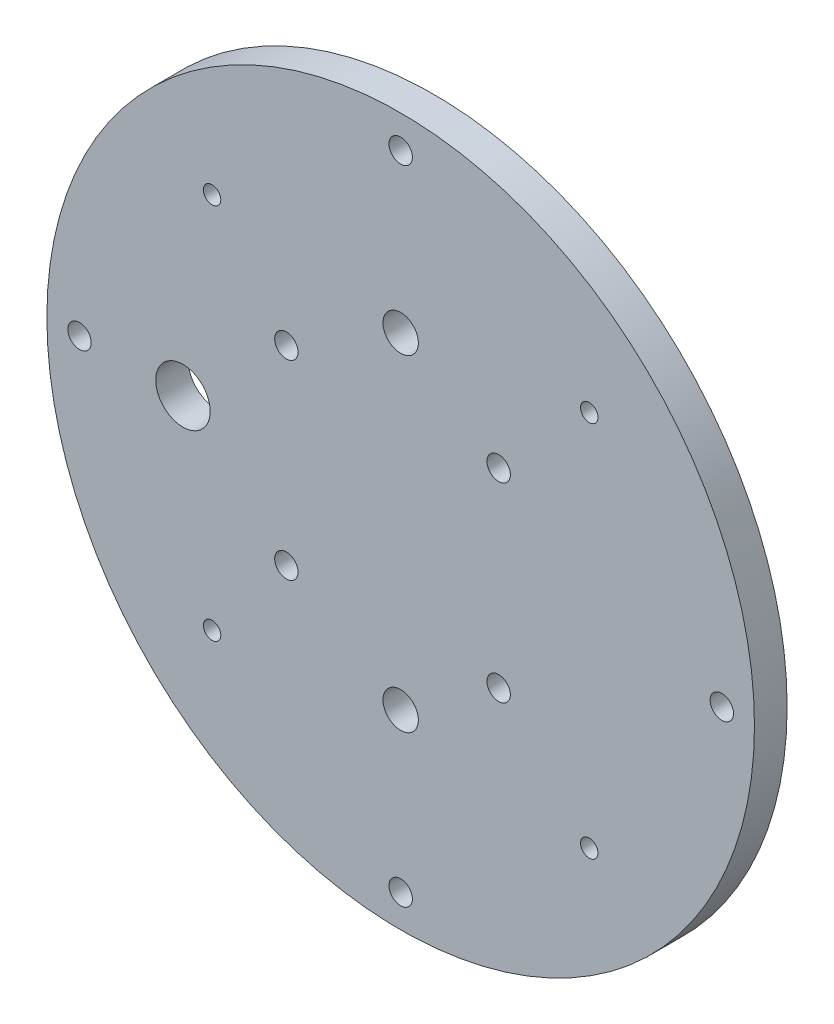
ISO-10303-21;
HEADER;
FILE_DESCRIPTION(('STEP AP214'),'2;1');
FILE_NAME('part.step','',(''),(''),'','','');
FILE_SCHEMA(('AUTOMOTIVE_DESIGN { 1 0 10303 214 1 1 1 1 }'));
ENDSEC;
DATA;
#1=APPLICATION_CONTEXT('core data for automotive mechanical design processes');
#2=APPLICATION_PROTOCOL_DEFINITION('international standard','automotive_design',2000,#1);
#3=PRODUCT_CONTEXT('',#1,'mechanical');
#4=PRODUCT('Part','Part','',(#3));
#5=PRODUCT_RELATED_PRODUCT_CATEGORY('part','',(#4));
#6=PRODUCT_DEFINITION_FORMATION('','',#4);
#7=PRODUCT_DEFINITION_CONTEXT('part definition',#1,'design');
#8=PRODUCT_DEFINITION('design','',#6,#7);
#9=PRODUCT_DEFINITION_SHAPE('','',#8);
#10=(LENGTH_UNIT() NAMED_UNIT(*) SI_UNIT(.MILLI.,.METRE.));
#11=(NAMED_UNIT(*) PLANE_ANGLE_UNIT() SI_UNIT($,.RADIAN.));
#12=(NAMED_UNIT(*) SI_UNIT($,.STERADIAN.) SOLID_ANGLE_UNIT());
#13=UNCERTAINTY_MEASURE_WITH_UNIT(LENGTH_MEASURE(1.E-05),#10,'distance_accuracy_value','');
#14=(GEOMETRIC_REPRESENTATION_CONTEXT(3) GLOBAL_UNCERTAINTY_ASSIGNED_CONTEXT((#13)) GLOBAL_UNIT_ASSIGNED_CONTEXT((#10,
#11,#12)) REPRESENTATION_CONTEXT('',''));
#15=CARTESIAN_POINT('',(0.,0.,0.));
#16=DIRECTION('',(0.,0.,1.));
#17=DIRECTION('',(1.,0.,0.));
#18=AXIS2_PLACEMENT_3D('',#15,#16,#17);
#19=CARTESIAN_POINT('',(0.,0.,6.));
#20=DIRECTION('',(0.,0.,1.));
#21=DIRECTION('',(1.,0.,0.));
#22=AXIS2_PLACEMENT_3D('',#19,#20,#21);
#23=PLANE('',#22);
#24=CARTESIAN_POINT('',(0.,-30.,6.));
#25=DIRECTION('',(0.,0.,1.));
#26=DIRECTION('',(1.,0.,0.));
#27=AXIS2_PLACEMENT_3D('',#24,#25,#26);
#28=CIRCLE('',#27,3.25);
#29=CARTESIAN_POINT('',(3.25,-30.,6.));
#30=VERTEX_POINT('',#29);
#31=EDGE_CURVE('E119',#30,#30,#28,.T.);
#32=ORIENTED_EDGE('',*,*,#31,.F.);
#33=EDGE_LOOP('',(#32));
#34=FACE_BOUND('',#33,.T.);
#35=CARTESIAN_POINT('',(18.,-17.5,6.));
#36=DIRECTION('',(0.,0.,1.));
#37=DIRECTION('',(1.,0.,0.));
#38=AXIS2_PLACEMENT_3D('',#35,#36,#37);
#39=CIRCLE('',#38,2.15);
#40=CARTESIAN_POINT('',(20.15,-17.5,6.));
#41=VERTEX_POINT('',#40);
#42=EDGE_CURVE('E107',#41,#41,#39,.T.);
#43=ORIENTED_EDGE('',*,*,#42,.F.);
#44=EDGE_LOOP('',(#43));
#45=FACE_BOUND('',#44,.T.);
#46=CARTESIAN_POINT('',(-21.,-17.5,6.));
#47=DIRECTION('',(0.,0.,1.));
#48=DIRECTION('',(1.,0.,0.));
#49=AXIS2_PLACEMENT_3D('',#46,#47,#48);
#50=CIRCLE('',#49,2.15);
#51=CARTESIAN_POINT('',(-18.85,-17.5,6.));
#52=VERTEX_POINT('',#51);
#53=EDGE_CURVE('E95',#52,#52,#50,.T.);
#54=ORIENTED_EDGE('',*,*,#53,.F.);
#55=EDGE_LOOP('',(#54));
#56=FACE_BOUND('',#55,.T.);
#57=CARTESIAN_POINT('',(0.,-59.,6.));
#58=DIRECTION('',(0.,0.,1.));
#59=DIRECTION('',(1.,0.,0.));
#60=AXIS2_PLACEMENT_3D('',#57,#58,#59);
#61=CIRCLE('',#60,2.15);
#62=CARTESIAN_POINT('',(2.14999999999999,-59.,6.));
#63=VERTEX_POINT('',#62);
#64=EDGE_CURVE('E83',#63,#63,#61,.T.);
#65=ORIENTED_EDGE('',*,*,#64,.F.);
#66=EDGE_LOOP('',(#65));
#67=FACE_BOUND('',#66,.T.);
#68=CARTESIAN_POINT('',(0.,59.,6.));
#69=DIRECTION('',(0.,0.,1.));
#70=DIRECTION('',(1.,0.,0.));
#71=AXIS2_PLACEMENT_3D('',#68,#69,#70);
#72=CIRCLE('',#71,2.15);
#73=CARTESIAN_POINT('',(2.15,59.,6.));
#74=VERTEX_POINT('',#73);
#75=EDGE_CURVE('E71',#74,#74,#72,.T.);
#76=ORIENTED_EDGE('',*,*,#75,.F.);
#77=EDGE_LOOP('',(#76));
#78=FACE_BOUND('',#77,.T.);
#79=CARTESIAN_POINT('',(34.6482322781408,-34.6482322781408,6.));
#80=DIRECTION('',(0.,0.,1.));
#81=DIRECTION('',(1.,0.,0.));
#82=AXIS2_PLACEMENT_3D('',#79,#80,#81);
#83=CIRCLE('',#82,1.6);
#84=CARTESIAN_POINT('',(36.2482322781408,-34.6482322781408,6.));
#85=VERTEX_POINT('',#84);
#86=EDGE_CURVE('E59',#85,#85,#83,.T.);
#87=ORIENTED_EDGE('',*,*,#86,.F.);
#88=EDGE_LOOP('',(#87));
#89=FACE_BOUND('',#88,.T.);
#90=CARTESIAN_POINT('',(-34.6482322781408,34.6482322781408,6.));
#91=DIRECTION('',(0.,0.,1.));
#92=DIRECTION('',(1.,0.,0.));
#93=AXIS2_PLACEMENT_3D('',#90,#91,#92);
#94=CIRCLE('',#93,1.6);
#95=CARTESIAN_POINT('',(-33.0482322781408,34.6482322781408,6.));
#96=VERTEX_POINT('',#95);
#97=EDGE_CURVE('E47',#96,#96,#94,.T.);
#98=ORIENTED_EDGE('',*,*,#97,.F.);
#99=EDGE_LOOP('',(#98));
#100=FACE_BOUND('',#99,.T.);
#101=CARTESIAN_POINT('',(0.,0.,6.));
#102=DIRECTION('',(0.,0.,1.));
#103=DIRECTION('',(1.,0.,0.));
#104=AXIS2_PLACEMENT_3D('',#101,#102,#103);
#105=CIRCLE('',#104,65.);
#106=CARTESIAN_POINT('',(65.,0.,6.));
#107=VERTEX_POINT('',#106);
#108=EDGE_CURVE('E10',#107,#107,#105,.T.);
#109=ORIENTED_EDGE('',*,*,#108,.T.);
#110=EDGE_LOOP('',(#109));
#111=FACE_BOUND('',#110,.T.);
#112=CARTESIAN_POINT('',(34.6482322781408,34.6482322781408,6.));
#113=DIRECTION('',(0.,0.,1.));
#114=DIRECTION('',(1.,0.,0.));
#115=AXIS2_PLACEMENT_3D('',#112,#113,#114);
#116=CIRCLE('',#115,1.6);
#117=CARTESIAN_POINT('',(36.2482322781408,34.6482322781408,6.));
#118=VERTEX_POINT('',#117);
#119=EDGE_CURVE('E42',#118,#118,#116,.T.);
#120=ORIENTED_EDGE('',*,*,#119,.F.);
#121=EDGE_LOOP('',(#120));
#122=FACE_BOUND('',#121,.T.);
#123=CARTESIAN_POINT('',(-34.6482322781408,-34.6482322781408,6.));
#124=DIRECTION('',(0.,0.,1.));
#125=DIRECTION('',(1.,0.,0.));
#126=AXIS2_PLACEMENT_3D('',#123,#124,#125);
#127=CIRCLE('',#126,1.6);
#128=CARTESIAN_POINT('',(-33.0482322781408,-34.6482322781408,6.));
#129=VERTEX_POINT('',#128);
#130=EDGE_CURVE('E53',#129,#129,#127,.T.);
#131=ORIENTED_EDGE('',*,*,#130,.F.);
#132=EDGE_LOOP('',(#131));
#133=FACE_BOUND('',#132,.T.);
#134=CARTESIAN_POINT('',(59.,0.,6.));
#135=DIRECTION('',(0.,0.,1.));
#136=DIRECTION('',(1.,0.,0.));
#137=AXIS2_PLACEMENT_3D('',#134,#135,#136);
#138=CIRCLE('',#137,2.15);
#139=CARTESIAN_POINT('',(61.15,0.,6.));
#140=VERTEX_POINT('',#139);
#141=EDGE_CURVE('E65',#140,#140,#138,.T.);
#142=ORIENTED_EDGE('',*,*,#141,.F.);
#143=EDGE_LOOP('',(#142));
#144=FACE_BOUND('',#143,.T.);
#145=CARTESIAN_POINT('',(-59.,0.,6.));
#146=DIRECTION('',(0.,0.,1.));
#147=DIRECTION('',(1.,0.,0.));
#148=AXIS2_PLACEMENT_3D('',#145,#146,#147);
#149=CIRCLE('',#148,2.15);
#150=CARTESIAN_POINT('',(-56.85,0.,6.));
#151=VERTEX_POINT('',#150);
#152=EDGE_CURVE('E77',#151,#151,#149,.T.);
#153=ORIENTED_EDGE('',*,*,#152,.F.);
#154=EDGE_LOOP('',(#153));
#155=FACE_BOUND('',#154,.T.);
#156=CARTESIAN_POINT('',(-21.,17.5,6.));
#157=DIRECTION('',(0.,0.,1.));
#158=DIRECTION('',(1.,0.,0.));
#159=AXIS2_PLACEMENT_3D('',#156,#157,#158);
#160=CIRCLE('',#159,2.15);
#161=CARTESIAN_POINT('',(-18.85,17.5,6.));
#162=VERTEX_POINT('',#161);
#163=EDGE_CURVE('E89',#162,#162,#160,.T.);
#164=ORIENTED_EDGE('',*,*,#163,.F.);
#165=EDGE_LOOP('',(#164));
#166=FACE_BOUND('',#165,.T.);
#167=CARTESIAN_POINT('',(18.,17.5,6.));
#168=DIRECTION('',(0.,0.,1.));
#169=DIRECTION('',(1.,0.,0.));
#170=AXIS2_PLACEMENT_3D('',#167,#168,#169);
#171=CIRCLE('',#170,2.15);
#172=CARTESIAN_POINT('',(20.15,17.5,6.));
#173=VERTEX_POINT('',#172);
#174=EDGE_CURVE('E101',#173,#173,#171,.T.);
#175=ORIENTED_EDGE('',*,*,#174,.F.);
#176=EDGE_LOOP('',(#175));
#177=FACE_BOUND('',#176,.T.);
#178=CARTESIAN_POINT('',(0.,30.,6.));
#179=DIRECTION('',(0.,0.,1.));
#180=DIRECTION('',(1.,0.,0.));
#181=AXIS2_PLACEMENT_3D('',#178,#179,#180);
#182=CIRCLE('',#181,3.25);
#183=CARTESIAN_POINT('',(3.25,30.,6.));
#184=VERTEX_POINT('',#183);
#185=EDGE_CURVE('E113',#184,#184,#182,.T.);
#186=ORIENTED_EDGE('',*,*,#185,.F.);
#187=EDGE_LOOP('',(#186));
#188=FACE_BOUND('',#187,.T.);
#189=CARTESIAN_POINT('',(-40.,0.,6.));
#190=DIRECTION('',(0.,0.,1.));
#191=DIRECTION('',(1.,0.,0.));
#192=AXIS2_PLACEMENT_3D('',#189,#190,#191);
#193=CIRCLE('',#192,5.);
#194=CARTESIAN_POINT('',(-35.,0.,6.));
#195=VERTEX_POINT('',#194);
#196=EDGE_CURVE('E125',#195,#195,#193,.T.);
#197=ORIENTED_EDGE('',*,*,#196,.F.);
#198=EDGE_LOOP('',(#197));
#199=FACE_BOUND('',#198,.T.);
#200=ADVANCED_FACE('F31',(#34,#45,#56,#67,#78,#89,#100,#111,#122,#133,#144,#155,#166,#177,#188,
#199),#23,.T.);
#201=CARTESIAN_POINT('',(0.,0.,0.));
#202=DIRECTION('',(0.,0.,1.));
#203=DIRECTION('',(1.,0.,0.));
#204=AXIS2_PLACEMENT_3D('',#201,#202,#203);
#205=PLANE('',#204);
#206=CARTESIAN_POINT('',(0.,0.,0.));
#207=DIRECTION('',(0.,0.,1.));
#208=DIRECTION('',(1.,0.,0.));
#209=AXIS2_PLACEMENT_3D('',#206,#207,#208);
#210=CIRCLE('',#209,65.);
#211=CARTESIAN_POINT('',(65.,0.,0.));
#212=VERTEX_POINT('',#211);
#213=EDGE_CURVE('E35',#212,#212,#210,.T.);
#214=ORIENTED_EDGE('',*,*,#213,.F.);
#215=EDGE_LOOP('',(#214));
#216=FACE_BOUND('',#215,.T.);
#217=CARTESIAN_POINT('',(34.6482322781408,34.6482322781408,0.));
#218=DIRECTION('',(0.,0.,1.));
#219=DIRECTION('',(1.,0.,0.));
#220=AXIS2_PLACEMENT_3D('',#217,#218,#219);
#221=CIRCLE('',#220,1.6);
#222=CARTESIAN_POINT('',(36.2482322781408,34.6482322781408,0.));
#223=VERTEX_POINT('',#222);
#224=EDGE_CURVE('E44',#223,#223,#221,.T.);
#225=ORIENTED_EDGE('',*,*,#224,.T.);
#226=EDGE_LOOP('',(#225));
#227=FACE_BOUND('',#226,.T.);
#228=CARTESIAN_POINT('',(-34.6482322781408,34.6482322781408,0.));
#229=DIRECTION('',(0.,0.,1.));
#230=DIRECTION('',(1.,0.,0.));
#231=AXIS2_PLACEMENT_3D('',#228,#229,#230);
#232=CIRCLE('',#231,1.6);
#233=CARTESIAN_POINT('',(-33.0482322781408,34.6482322781408,0.));
#234=VERTEX_POINT('',#233);
#235=EDGE_CURVE('E50',#234,#234,#232,.T.);
#236=ORIENTED_EDGE('',*,*,#235,.T.);
#237=EDGE_LOOP('',(#236));
#238=FACE_BOUND('',#237,.T.);
#239=CARTESIAN_POINT('',(-34.6482322781408,-34.6482322781408,0.));
#240=DIRECTION('',(0.,0.,1.));
#241=DIRECTION('',(1.,0.,0.));
#242=AXIS2_PLACEMENT_3D('',#239,#240,#241);
#243=CIRCLE('',#242,1.6);
#244=CARTESIAN_POINT('',(-33.0482322781408,-34.6482322781408,0.));
#245=VERTEX_POINT('',#244);
#246=EDGE_CURVE('E56',#245,#245,#243,.T.);
#247=ORIENTED_EDGE('',*,*,#246,.T.);
#248=EDGE_LOOP('',(#247));
#249=FACE_BOUND('',#248,.T.);
#250=CARTESIAN_POINT('',(34.6482322781408,-34.6482322781408,0.));
#251=DIRECTION('',(0.,0.,1.));
#252=DIRECTION('',(1.,0.,0.));
#253=AXIS2_PLACEMENT_3D('',#250,#251,#252);
#254=CIRCLE('',#253,1.6);
#255=CARTESIAN_POINT('',(36.2482322781408,-34.6482322781408,0.));
#256=VERTEX_POINT('',#255);
#257=EDGE_CURVE('E62',#256,#256,#254,.T.);
#258=ORIENTED_EDGE('',*,*,#257,.T.);
#259=EDGE_LOOP('',(#258));
#260=FACE_BOUND('',#259,.T.);
#261=CARTESIAN_POINT('',(59.,0.,0.));
#262=DIRECTION('',(0.,0.,1.));
#263=DIRECTION('',(1.,0.,0.));
#264=AXIS2_PLACEMENT_3D('',#261,#262,#263);
#265=CIRCLE('',#264,2.15);
#266=CARTESIAN_POINT('',(61.15,0.,0.));
#267=VERTEX_POINT('',#266);
#268=EDGE_CURVE('E68',#267,#267,#265,.T.);
#269=ORIENTED_EDGE('',*,*,#268,.T.);
#270=EDGE_LOOP('',(#269));
#271=FACE_BOUND('',#270,.T.);
#272=CARTESIAN_POINT('',(0.,59.,0.));
#273=DIRECTION('',(0.,0.,1.));
#274=DIRECTION('',(1.,0.,0.));
#275=AXIS2_PLACEMENT_3D('',#272,#273,#274);
#276=CIRCLE('',#275,2.15);
#277=CARTESIAN_POINT('',(2.15,59.,0.));
#278=VERTEX_POINT('',#277);
#279=EDGE_CURVE('E74',#278,#278,#276,.T.);
#280=ORIENTED_EDGE('',*,*,#279,.T.);
#281=EDGE_LOOP('',(#280));
#282=FACE_BOUND('',#281,.T.);
#283=CARTESIAN_POINT('',(-59.,0.,0.));
#284=DIRECTION('',(0.,0.,1.));
#285=DIRECTION('',(1.,0.,0.));
#286=AXIS2_PLACEMENT_3D('',#283,#284,#285);
#287=CIRCLE('',#286,2.15);
#288=CARTESIAN_POINT('',(-56.85,0.,0.));
#289=VERTEX_POINT('',#288);
#290=EDGE_CURVE('E80',#289,#289,#287,.T.);
#291=ORIENTED_EDGE('',*,*,#290,.T.);
#292=EDGE_LOOP('',(#291));
#293=FACE_BOUND('',#292,.T.);
#294=CARTESIAN_POINT('',(0.,-59.,0.));
#295=DIRECTION('',(0.,0.,1.));
#296=DIRECTION('',(1.,0.,0.));
#297=AXIS2_PLACEMENT_3D('',#294,#295,#296);
#298=CIRCLE('',#297,2.15);
#299=CARTESIAN_POINT('',(2.14999999999999,-59.,0.));
#300=VERTEX_POINT('',#299);
#301=EDGE_CURVE('E86',#300,#300,#298,.T.);
#302=ORIENTED_EDGE('',*,*,#301,.T.);
#303=EDGE_LOOP('',(#302));
#304=FACE_BOUND('',#303,.T.);
#305=CARTESIAN_POINT('',(-21.,17.5,0.));
#306=DIRECTION('',(0.,0.,1.));
#307=DIRECTION('',(1.,0.,0.));
#308=AXIS2_PLACEMENT_3D('',#305,#306,#307);
#309=CIRCLE('',#308,2.15);
#310=CARTESIAN_POINT('',(-18.85,17.5,0.));
#311=VERTEX_POINT('',#310);
#312=EDGE_CURVE('E92',#311,#311,#309,.T.);
#313=ORIENTED_EDGE('',*,*,#312,.T.);
#314=EDGE_LOOP('',(#313));
#315=FACE_BOUND('',#314,.T.);
#316=CARTESIAN_POINT('',(-21.,-17.5,0.));
#317=DIRECTION('',(0.,0.,1.));
#318=DIRECTION('',(1.,0.,0.));
#319=AXIS2_PLACEMENT_3D('',#316,#317,#318);
#320=CIRCLE('',#319,2.15);
#321=CARTESIAN_POINT('',(-18.85,-17.5,0.));
#322=VERTEX_POINT('',#321);
#323=EDGE_CURVE('E98',#322,#322,#320,.T.);
#324=ORIENTED_EDGE('',*,*,#323,.T.);
#325=EDGE_LOOP('',(#324));
#326=FACE_BOUND('',#325,.T.);
#327=CARTESIAN_POINT('',(18.,17.5,0.));
#328=DIRECTION('',(0.,0.,1.));
#329=DIRECTION('',(1.,0.,0.));
#330=AXIS2_PLACEMENT_3D('',#327,#328,#329);
#331=CIRCLE('',#330,2.15);
#332=CARTESIAN_POINT('',(20.15,17.5,0.));
#333=VERTEX_POINT('',#332);
#334=EDGE_CURVE('E104',#333,#333,#331,.T.);
#335=ORIENTED_EDGE('',*,*,#334,.T.);
#336=EDGE_LOOP('',(#335));
#337=FACE_BOUND('',#336,.T.);
#338=CARTESIAN_POINT('',(18.,-17.5,0.));
#339=DIRECTION('',(0.,0.,1.));
#340=DIRECTION('',(1.,0.,0.));
#341=AXIS2_PLACEMENT_3D('',#338,#339,#340);
#342=CIRCLE('',#341,2.15);
#343=CARTESIAN_POINT('',(20.15,-17.5,0.));
#344=VERTEX_POINT('',#343);
#345=EDGE_CURVE('E110',#344,#344,#342,.T.);
#346=ORIENTED_EDGE('',*,*,#345,.T.);
#347=EDGE_LOOP('',(#346));
#348=FACE_BOUND('',#347,.T.);
#349=CARTESIAN_POINT('',(0.,30.,0.));
#350=DIRECTION('',(0.,0.,1.));
#351=DIRECTION('',(1.,0.,0.));
#352=AXIS2_PLACEMENT_3D('',#349,#350,#351);
#353=CIRCLE('',#352,3.25);
#354=CARTESIAN_POINT('',(3.25,30.,0.));
#355=VERTEX_POINT('',#354);
#356=EDGE_CURVE('E116',#355,#355,#353,.T.);
#357=ORIENTED_EDGE('',*,*,#356,.T.);
#358=EDGE_LOOP('',(#357));
#359=FACE_BOUND('',#358,.T.);
#360=CARTESIAN_POINT('',(0.,-30.,0.));
#361=DIRECTION('',(0.,0.,1.));
#362=DIRECTION('',(1.,0.,0.));
#363=AXIS2_PLACEMENT_3D('',#360,#361,#362);
#364=CIRCLE('',#363,3.25);
#365=CARTESIAN_POINT('',(3.25,-30.,0.));
#366=VERTEX_POINT('',#365);
#367=EDGE_CURVE('E122',#366,#366,#364,.T.);
#368=ORIENTED_EDGE('',*,*,#367,.T.);
#369=EDGE_LOOP('',(#368));
#370=FACE_BOUND('',#369,.T.);
#371=CARTESIAN_POINT('',(-40.,0.,0.));
#372=DIRECTION('',(0.,0.,1.));
#373=DIRECTION('',(1.,0.,0.));
#374=AXIS2_PLACEMENT_3D('',#371,#372,#373);
#375=CIRCLE('',#374,5.);
#376=CARTESIAN_POINT('',(-35.,0.,0.));
#377=VERTEX_POINT('',#376);
#378=EDGE_CURVE('E128',#377,#377,#375,.T.);
#379=ORIENTED_EDGE('',*,*,#378,.T.);
#380=EDGE_LOOP('',(#379));
#381=FACE_BOUND('',#380,.T.);
#382=ADVANCED_FACE('F138',(#216,#227,#238,#249,#260,#271,#282,#293,#304,#315,#326,#337,#348,
#359,#370,#381),#205,.F.);
#383=CARTESIAN_POINT('',(0.,0.,6.));
#384=DIRECTION('',(0.,0.,-1.));
#385=DIRECTION('',(-1.,0.,0.));
#386=AXIS2_PLACEMENT_3D('',#383,#384,#385);
#387=CYLINDRICAL_SURFACE('',#386,65.);
#388=ORIENTED_EDGE('',*,*,#108,.F.);
#389=EDGE_LOOP('',(#388));
#390=FACE_BOUND('',#389,.T.);
#391=ORIENTED_EDGE('',*,*,#213,.T.);
#392=EDGE_LOOP('',(#391));
#393=FACE_BOUND('',#392,.T.);
#394=ADVANCED_FACE('F33',(#390,#393),#387,.T.);
#395=CARTESIAN_POINT('',(34.6482322781408,34.6482322781408,6.));
#396=DIRECTION('',(0.,0.,-1.));
#397=DIRECTION('',(-1.,0.,0.));
#398=AXIS2_PLACEMENT_3D('',#395,#396,#397);
#399=CYLINDRICAL_SURFACE('',#398,1.6);
#400=ORIENTED_EDGE('',*,*,#119,.T.);
#401=EDGE_LOOP('',(#400));
#402=FACE_BOUND('',#401,.T.);
#403=ORIENTED_EDGE('',*,*,#224,.F.);
#404=EDGE_LOOP('',(#403));
#405=FACE_BOUND('',#404,.T.);
#406=ADVANCED_FACE('F148',(#402,#405),#399,.F.);
#407=CARTESIAN_POINT('',(-34.6482322781408,34.6482322781408,6.));
#408=DIRECTION('',(0.,0.,-1.));
#409=DIRECTION('',(-1.,0.,0.));
#410=AXIS2_PLACEMENT_3D('',#407,#408,#409);
#411=CYLINDRICAL_SURFACE('',#410,1.6);
#412=ORIENTED_EDGE('',*,*,#97,.T.);
#413=EDGE_LOOP('',(#412));
#414=FACE_BOUND('',#413,.T.);
#415=ORIENTED_EDGE('',*,*,#235,.F.);
#416=EDGE_LOOP('',(#415));
#417=FACE_BOUND('',#416,.T.);
#418=ADVANCED_FACE('F151',(#414,#417),#411,.F.);
#419=CARTESIAN_POINT('',(-34.6482322781408,-34.6482322781408,6.));
#420=DIRECTION('',(0.,0.,-1.));
#421=DIRECTION('',(-1.,0.,0.));
#422=AXIS2_PLACEMENT_3D('',#419,#420,#421);
#423=CYLINDRICAL_SURFACE('',#422,1.6);
#424=ORIENTED_EDGE('',*,*,#130,.T.);
#425=EDGE_LOOP('',(#424));
#426=FACE_BOUND('',#425,.T.);
#427=ORIENTED_EDGE('',*,*,#246,.F.);
#428=EDGE_LOOP('',(#427));
#429=FACE_BOUND('',#428,.T.);
#430=ADVANCED_FACE('F155',(#426,#429),#423,.F.);
#431=CARTESIAN_POINT('',(34.6482322781408,-34.6482322781408,6.));
#432=DIRECTION('',(0.,0.,-1.));
#433=DIRECTION('',(-1.,0.,0.));
#434=AXIS2_PLACEMENT_3D('',#431,#432,#433);
#435=CYLINDRICAL_SURFACE('',#434,1.6);
#436=ORIENTED_EDGE('',*,*,#86,.T.);
#437=EDGE_LOOP('',(#436));
#438=FACE_BOUND('',#437,.T.);
#439=ORIENTED_EDGE('',*,*,#257,.F.);
#440=EDGE_LOOP('',(#439));
#441=FACE_BOUND('',#440,.T.);
#442=ADVANCED_FACE('F159',(#438,#441),#435,.F.);
#443=CARTESIAN_POINT('',(59.,0.,6.));
#444=DIRECTION('',(0.,0.,-1.));
#445=DIRECTION('',(-1.,0.,0.));
#446=AXIS2_PLACEMENT_3D('',#443,#444,#445);
#447=CYLINDRICAL_SURFACE('',#446,2.15);
#448=ORIENTED_EDGE('',*,*,#141,.T.);
#449=EDGE_LOOP('',(#448));
#450=FACE_BOUND('',#449,.T.);
#451=ORIENTED_EDGE('',*,*,#268,.F.);
#452=EDGE_LOOP('',(#451));
#453=FACE_BOUND('',#452,.T.);
#454=ADVANCED_FACE('F163',(#450,#453),#447,.F.);
#455=CARTESIAN_POINT('',(0.,59.,6.));
#456=DIRECTION('',(0.,0.,-1.));
#457=DIRECTION('',(-1.,0.,0.));
#458=AXIS2_PLACEMENT_3D('',#455,#456,#457);
#459=CYLINDRICAL_SURFACE('',#458,2.15);
#460=ORIENTED_EDGE('',*,*,#75,.T.);
#461=EDGE_LOOP('',(#460));
#462=FACE_BOUND('',#461,.T.);
#463=ORIENTED_EDGE('',*,*,#279,.F.);
#464=EDGE_LOOP('',(#463));
#465=FACE_BOUND('',#464,.T.);
#466=ADVANCED_FACE('F167',(#462,#465),#459,.F.);
#467=CARTESIAN_POINT('',(-59.,0.,6.));
#468=DIRECTION('',(0.,0.,-1.));
#469=DIRECTION('',(-1.,0.,0.));
#470=AXIS2_PLACEMENT_3D('',#467,#468,#469);
#471=CYLINDRICAL_SURFACE('',#470,2.15);
#472=ORIENTED_EDGE('',*,*,#152,.T.);
#473=EDGE_LOOP('',(#472));
#474=FACE_BOUND('',#473,.T.);
#475=ORIENTED_EDGE('',*,*,#290,.F.);
#476=EDGE_LOOP('',(#475));
#477=FACE_BOUND('',#476,.T.);
#478=ADVANCED_FACE('F171',(#474,#477),#471,.F.);
#479=CARTESIAN_POINT('',(0.,-59.,6.));
#480=DIRECTION('',(0.,0.,-1.));
#481=DIRECTION('',(-1.,0.,0.));
#482=AXIS2_PLACEMENT_3D('',#479,#480,#481);
#483=CYLINDRICAL_SURFACE('',#482,2.15);
#484=ORIENTED_EDGE('',*,*,#64,.T.);
#485=EDGE_LOOP('',(#484));
#486=FACE_BOUND('',#485,.T.);
#487=ORIENTED_EDGE('',*,*,#301,.F.);
#488=EDGE_LOOP('',(#487));
#489=FACE_BOUND('',#488,.T.);
#490=ADVANCED_FACE('F175',(#486,#489),#483,.F.);
#491=CARTESIAN_POINT('',(-21.,17.5,6.));
#492=DIRECTION('',(0.,0.,-1.));
#493=DIRECTION('',(-1.,0.,0.));
#494=AXIS2_PLACEMENT_3D('',#491,#492,#493);
#495=CYLINDRICAL_SURFACE('',#494,2.15);
#496=ORIENTED_EDGE('',*,*,#163,.T.);
#497=EDGE_LOOP('',(#496));
#498=FACE_BOUND('',#497,.T.);
#499=ORIENTED_EDGE('',*,*,#312,.F.);
#500=EDGE_LOOP('',(#499));
#501=FACE_BOUND('',#500,.T.);
#502=ADVANCED_FACE('F179',(#498,#501),#495,.F.);
#503=CARTESIAN_POINT('',(-21.,-17.5,6.));
#504=DIRECTION('',(0.,0.,-1.));
#505=DIRECTION('',(-1.,0.,0.));
#506=AXIS2_PLACEMENT_3D('',#503,#504,#505);
#507=CYLINDRICAL_SURFACE('',#506,2.15);
#508=ORIENTED_EDGE('',*,*,#53,.T.);
#509=EDGE_LOOP('',(#508));
#510=FACE_BOUND('',#509,.T.);
#511=ORIENTED_EDGE('',*,*,#323,.F.);
#512=EDGE_LOOP('',(#511));
#513=FACE_BOUND('',#512,.T.);
#514=ADVANCED_FACE('F183',(#510,#513),#507,.F.);
#515=CARTESIAN_POINT('',(18.,17.5,6.));
#516=DIRECTION('',(0.,0.,-1.));
#517=DIRECTION('',(-1.,0.,0.));
#518=AXIS2_PLACEMENT_3D('',#515,#516,#517);
#519=CYLINDRICAL_SURFACE('',#518,2.15);
#520=ORIENTED_EDGE('',*,*,#174,.T.);
#521=EDGE_LOOP('',(#520));
#522=FACE_BOUND('',#521,.T.);
#523=ORIENTED_EDGE('',*,*,#334,.F.);
#524=EDGE_LOOP('',(#523));
#525=FACE_BOUND('',#524,.T.);
#526=ADVANCED_FACE('F187',(#522,#525),#519,.F.);
#527=CARTESIAN_POINT('',(18.,-17.5,6.));
#528=DIRECTION('',(0.,0.,-1.));
#529=DIRECTION('',(-1.,0.,0.));
#530=AXIS2_PLACEMENT_3D('',#527,#528,#529);
#531=CYLINDRICAL_SURFACE('',#530,2.15);
#532=ORIENTED_EDGE('',*,*,#42,.T.);
#533=EDGE_LOOP('',(#532));
#534=FACE_BOUND('',#533,.T.);
#535=ORIENTED_EDGE('',*,*,#345,.F.);
#536=EDGE_LOOP('',(#535));
#537=FACE_BOUND('',#536,.T.);
#538=ADVANCED_FACE('F191',(#534,#537),#531,.F.);
#539=CARTESIAN_POINT('',(0.,30.,6.));
#540=DIRECTION('',(0.,0.,-1.));
#541=DIRECTION('',(-1.,0.,0.));
#542=AXIS2_PLACEMENT_3D('',#539,#540,#541);
#543=CYLINDRICAL_SURFACE('',#542,3.25);
#544=ORIENTED_EDGE('',*,*,#185,.T.);
#545=EDGE_LOOP('',(#544));
#546=FACE_BOUND('',#545,.T.);
#547=ORIENTED_EDGE('',*,*,#356,.F.);
#548=EDGE_LOOP('',(#547));
#549=FACE_BOUND('',#548,.T.);
#550=ADVANCED_FACE('F195',(#546,#549),#543,.F.);
#551=CARTESIAN_POINT('',(0.,-30.,6.));
#552=DIRECTION('',(0.,0.,-1.));
#553=DIRECTION('',(-1.,0.,0.));
#554=AXIS2_PLACEMENT_3D('',#551,#552,#553);
#555=CYLINDRICAL_SURFACE('',#554,3.25);
#556=ORIENTED_EDGE('',*,*,#31,.T.);
#557=EDGE_LOOP('',(#556));
#558=FACE_BOUND('',#557,.T.);
#559=ORIENTED_EDGE('',*,*,#367,.F.);
#560=EDGE_LOOP('',(#559));
#561=FACE_BOUND('',#560,.T.);
#562=ADVANCED_FACE('F199',(#558,#561),#555,.F.);
#563=CARTESIAN_POINT('',(-40.,0.,6.));
#564=DIRECTION('',(0.,0.,-1.));
#565=DIRECTION('',(-1.,0.,0.));
#566=AXIS2_PLACEMENT_3D('',#563,#564,#565);
#567=CYLINDRICAL_SURFACE('',#566,5.);
#568=ORIENTED_EDGE('',*,*,#196,.T.);
#569=EDGE_LOOP('',(#568));
#570=FACE_BOUND('',#569,.T.);
#571=ORIENTED_EDGE('',*,*,#378,.F.);
#572=EDGE_LOOP('',(#571));
#573=FACE_BOUND('',#572,.T.);
#574=ADVANCED_FACE('F134',(#570,#573),#567,.F.);
#575=CLOSED_SHELL('',(#200,#382,#394,#406,#418,#430,#442,#454,#466,#478,#490,#502,#514,#526,
#538,#550,#562,#574));
#576=MANIFOLD_SOLID_BREP('B2',#575);
#577=ADVANCED_BREP_SHAPE_REPRESENTATION('',(#18,#576),#14);
#578=SHAPE_DEFINITION_REPRESENTATION(#9,#577);
ENDSEC;
END-ISO-10303-21;
